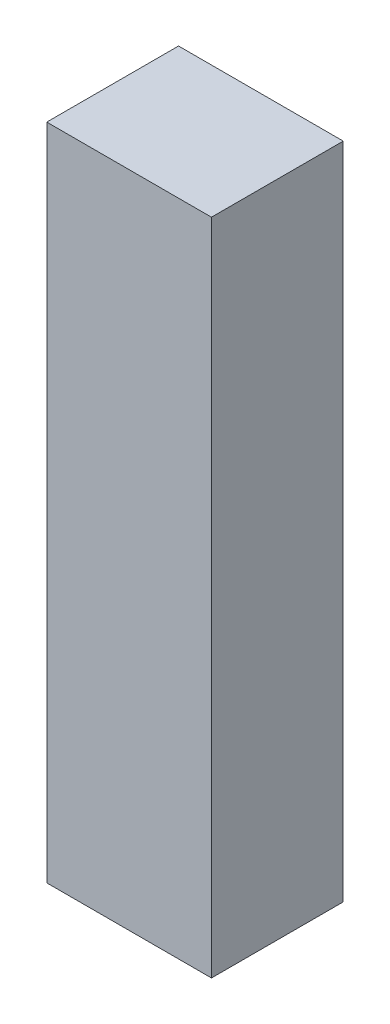
ISO-10303-21;
HEADER;
FILE_DESCRIPTION(('STEP AP214'),'2;1');
FILE_NAME('part.step','',(''),(''),'','','');
FILE_SCHEMA(('AUTOMOTIVE_DESIGN { 1 0 10303 214 1 1 1 1 }'));
ENDSEC;
DATA;
#1=APPLICATION_CONTEXT('core data for automotive mechanical design processes');
#2=APPLICATION_PROTOCOL_DEFINITION('international standard','automotive_design',2000,#1);
#3=PRODUCT_CONTEXT('',#1,'mechanical');
#4=PRODUCT('Part','Part','',(#3));
#5=PRODUCT_RELATED_PRODUCT_CATEGORY('part','',(#4));
#6=PRODUCT_DEFINITION_FORMATION('','',#4);
#7=PRODUCT_DEFINITION_CONTEXT('part definition',#1,'design');
#8=PRODUCT_DEFINITION('design','',#6,#7);
#9=PRODUCT_DEFINITION_SHAPE('','',#8);
#10=(LENGTH_UNIT() NAMED_UNIT(*) SI_UNIT(.MILLI.,.METRE.));
#11=(NAMED_UNIT(*) PLANE_ANGLE_UNIT() SI_UNIT($,.RADIAN.));
#12=(NAMED_UNIT(*) SI_UNIT($,.STERADIAN.) SOLID_ANGLE_UNIT());
#13=UNCERTAINTY_MEASURE_WITH_UNIT(LENGTH_MEASURE(1.E-05),#10,'distance_accuracy_value','');
#14=(GEOMETRIC_REPRESENTATION_CONTEXT(3) GLOBAL_UNCERTAINTY_ASSIGNED_CONTEXT((#13)) GLOBAL_UNIT_ASSIGNED_CONTEXT((#10,
#11,#12)) REPRESENTATION_CONTEXT('',''));
#15=CARTESIAN_POINT('',(0.,0.,0.));
#16=DIRECTION('',(0.,0.,1.));
#17=DIRECTION('',(1.,0.,0.));
#18=AXIS2_PLACEMENT_3D('',#15,#16,#17);
#19=CARTESIAN_POINT('',(200.,330.,-776.));
#20=DIRECTION('',(-1.,0.,0.));
#21=DIRECTION('',(0.,0.,1.));
#22=AXIS2_PLACEMENT_3D('',#19,#20,#21);
#23=PLANE('',#22);
#24=DIRECTION('',(0.,-1.,0.));
#25=VECTOR('',#24,1.);
#26=CARTESIAN_POINT('',(200.,330.,-736.));
#27=LINE('',#26,#25);
#28=CARTESIAN_POINT('',(200.,530.,-736.));
#29=VERTEX_POINT('',#28);
#30=CARTESIAN_POINT('',(200.,330.,-736.));
#31=VERTEX_POINT('',#30);
#32=EDGE_CURVE('E103',#29,#31,#27,.T.);
#33=ORIENTED_EDGE('',*,*,#32,.F.);
#34=DIRECTION('',(0.,0.,1.));
#35=VECTOR('',#34,1.);
#36=CARTESIAN_POINT('',(200.,530.,-776.));
#37=LINE('',#36,#35);
#38=CARTESIAN_POINT('',(200.,530.,-776.));
#39=VERTEX_POINT('',#38);
#40=EDGE_CURVE('E11',#39,#29,#37,.T.);
#41=ORIENTED_EDGE('',*,*,#40,.F.);
#42=DIRECTION('',(0.,-1.,0.));
#43=VECTOR('',#42,1.);
#44=CARTESIAN_POINT('',(200.,330.,-776.));
#45=LINE('',#44,#43);
#46=CARTESIAN_POINT('',(200.,330.,-776.));
#47=VERTEX_POINT('',#46);
#48=EDGE_CURVE('E97',#39,#47,#45,.T.);
#49=ORIENTED_EDGE('',*,*,#48,.T.);
#50=DIRECTION('',(0.,0.,1.));
#51=VECTOR('',#50,1.);
#52=CARTESIAN_POINT('',(200.,330.,-776.));
#53=LINE('',#52,#51);
#54=EDGE_CURVE('E42',#47,#31,#53,.T.);
#55=ORIENTED_EDGE('',*,*,#54,.T.);
#56=EDGE_LOOP('',(#33,#41,#49,#55));
#57=FACE_BOUND('',#56,.T.);
#58=ADVANCED_FACE('F39',(#57),#23,.T.);
#59=CARTESIAN_POINT('',(200.,530.,-776.));
#60=DIRECTION('',(0.,1.,0.));
#61=DIRECTION('',(0.,0.,1.));
#62=AXIS2_PLACEMENT_3D('',#59,#60,#61);
#63=PLANE('',#62);
#64=DIRECTION('',(-1.,0.,0.));
#65=VECTOR('',#64,1.);
#66=CARTESIAN_POINT('',(200.,530.,-736.));
#67=LINE('',#66,#65);
#68=CARTESIAN_POINT('',(250.,530.,-736.));
#69=VERTEX_POINT('',#68);
#70=EDGE_CURVE('E99',#69,#29,#67,.T.);
#71=ORIENTED_EDGE('',*,*,#70,.F.);
#72=DIRECTION('',(0.,0.,1.));
#73=VECTOR('',#72,1.);
#74=CARTESIAN_POINT('',(250.,530.,-776.));
#75=LINE('',#74,#73);
#76=CARTESIAN_POINT('',(250.,530.,-776.));
#77=VERTEX_POINT('',#76);
#78=EDGE_CURVE('E48',#77,#69,#75,.T.);
#79=ORIENTED_EDGE('',*,*,#78,.F.);
#80=DIRECTION('',(-1.,0.,0.));
#81=VECTOR('',#80,1.);
#82=CARTESIAN_POINT('',(200.,530.,-776.));
#83=LINE('',#82,#81);
#84=EDGE_CURVE('E94',#77,#39,#83,.T.);
#85=ORIENTED_EDGE('',*,*,#84,.T.);
#86=ORIENTED_EDGE('',*,*,#40,.T.);
#87=EDGE_LOOP('',(#71,#79,#85,#86));
#88=FACE_BOUND('',#87,.T.);
#89=ADVANCED_FACE('F113',(#88),#63,.T.);
#90=CARTESIAN_POINT('',(250.,330.,-776.));
#91=DIRECTION('',(1.,0.,0.));
#92=DIRECTION('',(0.,0.,-1.));
#93=AXIS2_PLACEMENT_3D('',#90,#91,#92);
#94=PLANE('',#93);
#95=DIRECTION('',(0.,1.,0.));
#96=VECTOR('',#95,1.);
#97=CARTESIAN_POINT('',(250.,330.,-736.));
#98=LINE('',#97,#96);
#99=CARTESIAN_POINT('',(250.,330.,-736.));
#100=VERTEX_POINT('',#99);
#101=EDGE_CURVE('E89',#100,#69,#98,.T.);
#102=ORIENTED_EDGE('',*,*,#101,.F.);
#103=DIRECTION('',(0.,0.,1.));
#104=VECTOR('',#103,1.);
#105=CARTESIAN_POINT('',(250.,330.,-776.));
#106=LINE('',#105,#104);
#107=CARTESIAN_POINT('',(250.,330.,-776.));
#108=VERTEX_POINT('',#107);
#109=EDGE_CURVE('E84',#108,#100,#106,.T.);
#110=ORIENTED_EDGE('',*,*,#109,.F.);
#111=DIRECTION('',(0.,1.,0.));
#112=VECTOR('',#111,1.);
#113=CARTESIAN_POINT('',(250.,330.,-776.));
#114=LINE('',#113,#112);
#115=EDGE_CURVE('E87',#108,#77,#114,.T.);
#116=ORIENTED_EDGE('',*,*,#115,.T.);
#117=ORIENTED_EDGE('',*,*,#78,.T.);
#118=EDGE_LOOP('',(#102,#110,#116,#117));
#119=FACE_BOUND('',#118,.T.);
#120=ADVANCED_FACE('F86',(#119),#94,.T.);
#121=CARTESIAN_POINT('',(200.,330.,-776.));
#122=DIRECTION('',(0.,-1.,0.));
#123=DIRECTION('',(0.,0.,-1.));
#124=AXIS2_PLACEMENT_3D('',#121,#122,#123);
#125=PLANE('',#124);
#126=DIRECTION('',(1.,0.,0.));
#127=VECTOR('',#126,1.);
#128=CARTESIAN_POINT('',(200.,330.,-736.));
#129=LINE('',#128,#127);
#130=EDGE_CURVE('E106',#31,#100,#129,.T.);
#131=ORIENTED_EDGE('',*,*,#130,.F.);
#132=ORIENTED_EDGE('',*,*,#54,.F.);
#133=DIRECTION('',(1.,0.,0.));
#134=VECTOR('',#133,1.);
#135=CARTESIAN_POINT('',(200.,330.,-776.));
#136=LINE('',#135,#134);
#137=EDGE_CURVE('E93',#47,#108,#136,.T.);
#138=ORIENTED_EDGE('',*,*,#137,.T.);
#139=ORIENTED_EDGE('',*,*,#109,.T.);
#140=EDGE_LOOP('',(#131,#132,#138,#139));
#141=FACE_BOUND('',#140,.T.);
#142=ADVANCED_FACE('F96',(#141),#125,.T.);
#143=CARTESIAN_POINT('',(0.,0.,-776.));
#144=DIRECTION('',(0.,0.,-1.));
#145=DIRECTION('',(-1.,0.,0.));
#146=AXIS2_PLACEMENT_3D('',#143,#144,#145);
#147=PLANE('',#146);
#148=ORIENTED_EDGE('',*,*,#48,.F.);
#149=ORIENTED_EDGE('',*,*,#84,.F.);
#150=ORIENTED_EDGE('',*,*,#115,.F.);
#151=ORIENTED_EDGE('',*,*,#137,.F.);
#152=EDGE_LOOP('',(#148,#149,#150,#151));
#153=FACE_BOUND('',#152,.T.);
#154=ADVANCED_FACE('F92',(#153),#147,.T.);
#155=CARTESIAN_POINT('',(0.,0.,-736.));
#156=DIRECTION('',(0.,0.,-1.));
#157=DIRECTION('',(-1.,0.,0.));
#158=AXIS2_PLACEMENT_3D('',#155,#156,#157);
#159=PLANE('',#158);
#160=ORIENTED_EDGE('',*,*,#32,.T.);
#161=ORIENTED_EDGE('',*,*,#130,.T.);
#162=ORIENTED_EDGE('',*,*,#101,.T.);
#163=ORIENTED_EDGE('',*,*,#70,.T.);
#164=EDGE_LOOP('',(#160,#161,#162,#163));
#165=FACE_BOUND('',#164,.T.);
#166=ADVANCED_FACE('F112',(#165),#159,.F.);
#167=CLOSED_SHELL('',(#58,#89,#120,#142,#154,#166));
#168=MANIFOLD_SOLID_BREP('B2',#167);
#169=ADVANCED_BREP_SHAPE_REPRESENTATION('',(#18,#168),#14);
#170=SHAPE_DEFINITION_REPRESENTATION(#9,#169);
ENDSEC;
END-ISO-10303-21;
